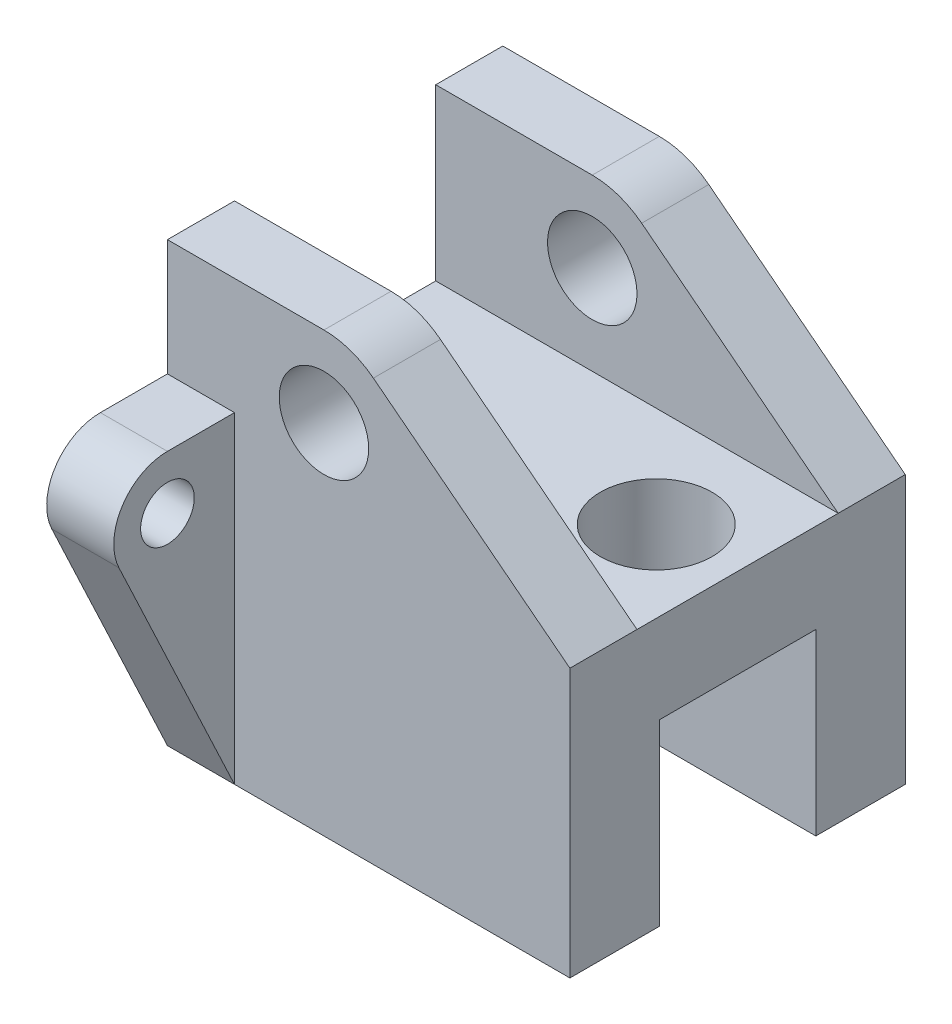
ISO-10303-21;
HEADER;
FILE_DESCRIPTION(('STEP AP214'),'2;1');
FILE_NAME('part.step','',(''),(''),'','','');
FILE_SCHEMA(('AUTOMOTIVE_DESIGN { 1 0 10303 214 1 1 1 1 }'));
ENDSEC;
DATA;
#1=APPLICATION_CONTEXT('core data for automotive mechanical design processes');
#2=APPLICATION_PROTOCOL_DEFINITION('international standard','automotive_design',2000,#1);
#3=PRODUCT_CONTEXT('',#1,'mechanical');
#4=PRODUCT('Part','Part','',(#3));
#5=PRODUCT_RELATED_PRODUCT_CATEGORY('part','',(#4));
#6=PRODUCT_DEFINITION_FORMATION('','',#4);
#7=PRODUCT_DEFINITION_CONTEXT('part definition',#1,'design');
#8=PRODUCT_DEFINITION('design','',#6,#7);
#9=PRODUCT_DEFINITION_SHAPE('','',#8);
#10=(LENGTH_UNIT() NAMED_UNIT(*) SI_UNIT(.MILLI.,.METRE.));
#11=(NAMED_UNIT(*) PLANE_ANGLE_UNIT() SI_UNIT($,.RADIAN.));
#12=(NAMED_UNIT(*) SI_UNIT($,.STERADIAN.) SOLID_ANGLE_UNIT());
#13=UNCERTAINTY_MEASURE_WITH_UNIT(LENGTH_MEASURE(1.E-05),#10,'distance_accuracy_value','');
#14=(GEOMETRIC_REPRESENTATION_CONTEXT(3) GLOBAL_UNCERTAINTY_ASSIGNED_CONTEXT((#13)) GLOBAL_UNIT_ASSIGNED_CONTEXT((#10,
#11,#12)) REPRESENTATION_CONTEXT('',''));
#15=CARTESIAN_POINT('',(0.,0.,0.));
#16=DIRECTION('',(0.,0.,1.));
#17=DIRECTION('',(1.,0.,0.));
#18=AXIS2_PLACEMENT_3D('',#15,#16,#17);
#19=CARTESIAN_POINT('',(-90.,60.,-49.2063492063491));
#20=DIRECTION('',(0.,0.,-1.));
#21=DIRECTION('',(-1.,0.,0.));
#22=AXIS2_PLACEMENT_3D('',#19,#20,#21);
#23=PLANE('',#22);
#24=CARTESIAN_POINT('',(-55.,80.,-49.2063492063491));
#25=DIRECTION('',(0.,0.,-1.));
#26=DIRECTION('',(-1.,0.,0.));
#27=AXIS2_PLACEMENT_3D('',#24,#25,#26);
#28=CIRCLE('',#27,9.99999999999999);
#29=CARTESIAN_POINT('',(-65.,80.,-49.2063492063491));
#30=VERTEX_POINT('',#29);
#31=EDGE_CURVE('E257',#30,#30,#28,.T.);
#32=ORIENTED_EDGE('',*,*,#31,.F.);
#33=EDGE_LOOP('',(#32));
#34=FACE_BOUND('',#33,.T.);
#35=DIRECTION('',(1.,0.,0.));
#36=VECTOR('',#35,1.);
#37=CARTESIAN_POINT('',(-90.,0.,-49.2063492063491));
#38=LINE('',#37,#36);
#39=CARTESIAN_POINT('',(-75.,0.,-49.2063492063491));
#40=VERTEX_POINT('',#39);
#41=CARTESIAN_POINT('',(0.,0.,-49.2063492063491));
#42=VERTEX_POINT('',#41);
#43=EDGE_CURVE('E210',#40,#42,#38,.T.);
#44=ORIENTED_EDGE('',*,*,#43,.F.);
#45=DIRECTION('',(0.,1.,0.));
#46=VECTOR('',#45,1.);
#47=CARTESIAN_POINT('',(-75.,72.,-49.2063492063491));
#48=LINE('',#47,#46);
#49=CARTESIAN_POINT('',(-75.,72.,-49.2063492063491));
#50=VERTEX_POINT('',#49);
#51=EDGE_CURVE('E203',#40,#50,#48,.T.);
#52=ORIENTED_EDGE('',*,*,#51,.T.);
#53=DIRECTION('',(-1.,0.,0.));
#54=VECTOR('',#53,1.);
#55=CARTESIAN_POINT('',(-75.,72.,-49.2063492063491));
#56=LINE('',#55,#54);
#57=CARTESIAN_POINT('',(-90.,72.,-49.2063492063491));
#58=VERTEX_POINT('',#57);
#59=EDGE_CURVE('E189',#50,#58,#56,.T.);
#60=ORIENTED_EDGE('',*,*,#59,.T.);
#61=DIRECTION('',(0.,1.,0.));
#62=VECTOR('',#61,1.);
#63=CARTESIAN_POINT('',(-90.,60.,-49.2063492063491));
#64=LINE('',#63,#62);
#65=CARTESIAN_POINT('',(-90.,98.,-49.2063492063491));
#66=VERTEX_POINT('',#65);
#67=EDGE_CURVE('E353',#58,#66,#64,.T.);
#68=ORIENTED_EDGE('',*,*,#67,.T.);
#69=DIRECTION('',(1.,0.,0.));
#70=VECTOR('',#69,1.);
#71=CARTESIAN_POINT('',(-90.,98.,-49.2063492063491));
#72=LINE('',#71,#70);
#73=CARTESIAN_POINT('',(-55.,98.,-49.2063492063491));
#74=VERTEX_POINT('',#73);
#75=EDGE_CURVE('E285',#66,#74,#72,.T.);
#76=ORIENTED_EDGE('',*,*,#75,.T.);
#77=CARTESIAN_POINT('',(-55.,80.,-49.2063492063491));
#78=DIRECTION('',(0.,0.,-1.));
#79=DIRECTION('',(-1.,0.,0.));
#80=AXIS2_PLACEMENT_3D('',#77,#78,#79);
#81=CIRCLE('',#80,18.);
#82=CARTESIAN_POINT('',(-43.9438877836644,94.2043085949227,-49.2063492063491));
#83=VERTEX_POINT('',#82);
#84=EDGE_CURVE('E270',#74,#83,#81,.T.);
#85=ORIENTED_EDGE('',*,*,#84,.T.);
#86=DIRECTION('',(0.789128255273486,-0.614228456463086,0.));
#87=VECTOR('',#86,1.);
#88=CARTESIAN_POINT('',(-43.9438877836644,94.2043085949227,-49.2063492063491));
#89=LINE('',#88,#87);
#90=CARTESIAN_POINT('',(0.,60.,-49.2063492063491));
#91=VERTEX_POINT('',#90);
#92=EDGE_CURVE('E264',#83,#91,#89,.T.);
#93=ORIENTED_EDGE('',*,*,#92,.T.);
#94=DIRECTION('',(0.,1.,0.));
#95=VECTOR('',#94,1.);
#96=CARTESIAN_POINT('',(0.,60.,-49.2063492063491));
#97=LINE('',#96,#95);
#98=EDGE_CURVE('E375',#42,#91,#97,.T.);
#99=ORIENTED_EDGE('',*,*,#98,.F.);
#100=EDGE_LOOP('',(#44,#52,#60,#68,#76,#85,#93,#99));
#101=FACE_BOUND('',#100,.T.);
#102=ADVANCED_FACE('F39',(#34,#101),#23,.T.);
#103=CARTESIAN_POINT('',(-90.,60.,25.7936507936508));
#104=DIRECTION('',(0.,1.,0.));
#105=DIRECTION('',(0.,0.,1.));
#106=AXIS2_PLACEMENT_3D('',#103,#104,#105);
#107=PLANE('',#106);
#108=CARTESIAN_POINT('',(-18.1950096257873,60.,-11.7063492063492));
#109=DIRECTION('',(0.,1.,0.));
#110=DIRECTION('',(0.,0.,1.));
#111=AXIS2_PLACEMENT_3D('',#108,#109,#110);
#112=CIRCLE('',#111,12.5);
#113=CARTESIAN_POINT('',(-18.1950096257873,60.,0.793650793650839));
#114=VERTEX_POINT('',#113);
#115=EDGE_CURVE('E828',#114,#114,#112,.T.);
#116=ORIENTED_EDGE('',*,*,#115,.F.);
#117=EDGE_LOOP('',(#116));
#118=FACE_BOUND('',#117,.T.);
#119=DIRECTION('',(0.,0.,1.));
#120=VECTOR('',#119,1.);
#121=CARTESIAN_POINT('',(0.,60.,25.7936507936508));
#122=LINE('',#121,#120);
#123=CARTESIAN_POINT('',(0.,60.,-34.2063492063491));
#124=VERTEX_POINT('',#123);
#125=CARTESIAN_POINT('',(0.,60.,10.7936507936508));
#126=VERTEX_POINT('',#125);
#127=EDGE_CURVE('E378',#124,#126,#122,.T.);
#128=ORIENTED_EDGE('',*,*,#127,.F.);
#129=DIRECTION('',(-1.,0.,0.));
#130=VECTOR('',#129,1.);
#131=CARTESIAN_POINT('',(0.,60.,-34.2063492063491));
#132=LINE('',#131,#130);
#133=CARTESIAN_POINT('',(-90.,60.,-34.2063492063491));
#134=VERTEX_POINT('',#133);
#135=EDGE_CURVE('E269',#124,#134,#132,.T.);
#136=ORIENTED_EDGE('',*,*,#135,.T.);
#137=DIRECTION('',(0.,0.,1.));
#138=VECTOR('',#137,1.);
#139=CARTESIAN_POINT('',(-90.,60.,25.7936507936508));
#140=LINE('',#139,#138);
#141=CARTESIAN_POINT('',(-90.,60.,10.7936507936508));
#142=VERTEX_POINT('',#141);
#143=EDGE_CURVE('E355',#134,#142,#140,.T.);
#144=ORIENTED_EDGE('',*,*,#143,.T.);
#145=DIRECTION('',(1.,0.,0.));
#146=VECTOR('',#145,1.);
#147=CARTESIAN_POINT('',(-90.,60.,10.7936507936508));
#148=LINE('',#147,#146);
#149=EDGE_CURVE('E303',#142,#126,#148,.T.);
#150=ORIENTED_EDGE('',*,*,#149,.T.);
#151=EDGE_LOOP('',(#128,#136,#144,#150));
#152=FACE_BOUND('',#151,.T.);
#153=ADVANCED_FACE('F437',(#118,#152),#107,.T.);
#154=CARTESIAN_POINT('',(-90.,0.,5.79365079365081));
#155=DIRECTION('',(0.,-1.,0.));
#156=DIRECTION('',(0.,0.,-1.));
#157=AXIS2_PLACEMENT_3D('',#154,#155,#156);
#158=PLANE('',#157);
#159=DIRECTION('',(0.,0.,-1.));
#160=VECTOR('',#159,1.);
#161=CARTESIAN_POINT('',(0.,0.,5.79365079365081));
#162=LINE('',#161,#160);
#163=CARTESIAN_POINT('',(0.,0.,25.7936507936508));
#164=VERTEX_POINT('',#163);
#165=CARTESIAN_POINT('',(0.,0.,5.79365079365081));
#166=VERTEX_POINT('',#165);
#167=EDGE_CURVE('E330',#164,#166,#162,.T.);
#168=ORIENTED_EDGE('',*,*,#167,.F.);
#169=DIRECTION('',(1.,0.,0.));
#170=VECTOR('',#169,1.);
#171=CARTESIAN_POINT('',(-90.,0.,25.7936507936508));
#172=LINE('',#171,#170);
#173=CARTESIAN_POINT('',(-75.,0.,25.7936507936508));
#174=VERTEX_POINT('',#173);
#175=EDGE_CURVE('E48',#174,#164,#172,.T.);
#176=ORIENTED_EDGE('',*,*,#175,.F.);
#177=CARTESIAN_POINT('',(-90.,0.,25.7936507936508));
#178=VERTEX_POINT('',#177);
#179=EDGE_CURVE('E11',#178,#174,#172,.T.);
#180=ORIENTED_EDGE('',*,*,#179,.F.);
#181=DIRECTION('',(0.,0.,-1.));
#182=VECTOR('',#181,1.);
#183=CARTESIAN_POINT('',(-90.,0.,5.79365079365081));
#184=LINE('',#183,#182);
#185=CARTESIAN_POINT('',(-90.,0.,5.79365079365081));
#186=VERTEX_POINT('',#185);
#187=EDGE_CURVE('E337',#178,#186,#184,.T.);
#188=ORIENTED_EDGE('',*,*,#187,.T.);
#189=DIRECTION('',(1.,0.,0.));
#190=VECTOR('',#189,1.);
#191=CARTESIAN_POINT('',(-90.,0.,5.79365079365081));
#192=LINE('',#191,#190);
#193=EDGE_CURVE('E360',#186,#166,#192,.T.);
#194=ORIENTED_EDGE('',*,*,#193,.T.);
#195=EDGE_LOOP('',(#168,#176,#180,#188,#194));
#196=FACE_BOUND('',#195,.T.);
#197=ADVANCED_FACE('F41',(#196),#158,.T.);
#198=CARTESIAN_POINT('',(-90.,0.,25.7936507936508));
#199=DIRECTION('',(0.,0.,1.));
#200=DIRECTION('',(0.,-1.,0.));
#201=AXIS2_PLACEMENT_3D('',#198,#199,#200);
#202=PLANE('',#201);
#203=DIRECTION('',(-1.,0.,0.));
#204=VECTOR('',#203,1.);
#205=CARTESIAN_POINT('',(-75.,72.,25.7936507936508));
#206=LINE('',#205,#204);
#207=CARTESIAN_POINT('',(-75.,72.,25.7936507936508));
#208=VERTEX_POINT('',#207);
#209=CARTESIAN_POINT('',(-90.,72.,25.7936507936508));
#210=VERTEX_POINT('',#209);
#211=EDGE_CURVE('E255',#208,#210,#206,.T.);
#212=ORIENTED_EDGE('',*,*,#211,.F.);
#213=DIRECTION('',(0.,-1.,0.));
#214=VECTOR('',#213,1.);
#215=CARTESIAN_POINT('',(-75.,0.,25.7936507936508));
#216=LINE('',#215,#214);
#217=EDGE_CURVE('E244',#208,#174,#216,.T.);
#218=ORIENTED_EDGE('',*,*,#217,.T.);
#219=ORIENTED_EDGE('',*,*,#175,.T.);
#220=DIRECTION('',(0.,-1.,0.));
#221=VECTOR('',#220,1.);
#222=CARTESIAN_POINT('',(0.,0.,25.7936507936508));
#223=LINE('',#222,#221);
#224=CARTESIAN_POINT('',(0.,60.,25.7936507936508));
#225=VERTEX_POINT('',#224);
#226=EDGE_CURVE('E341',#225,#164,#223,.T.);
#227=ORIENTED_EDGE('',*,*,#226,.F.);
#228=DIRECTION('',(-0.789128255273486,0.614228456463086,0.));
#229=VECTOR('',#228,1.);
#230=CARTESIAN_POINT('',(0.,60.,25.7936507936508));
#231=LINE('',#230,#229);
#232=CARTESIAN_POINT('',(-43.9438877836645,94.2043085949227,25.7936507936508));
#233=VERTEX_POINT('',#232);
#234=EDGE_CURVE('E300',#225,#233,#231,.T.);
#235=ORIENTED_EDGE('',*,*,#234,.T.);
#236=CARTESIAN_POINT('',(-55.,80.,25.7936507936508));
#237=DIRECTION('',(0.,0.,1.));
#238=DIRECTION('',(1.,0.,0.));
#239=AXIS2_PLACEMENT_3D('',#236,#237,#238);
#240=CIRCLE('',#239,18.);
#241=CARTESIAN_POINT('',(-55.,98.,25.7936507936508));
#242=VERTEX_POINT('',#241);
#243=EDGE_CURVE('E322',#233,#242,#240,.T.);
#244=ORIENTED_EDGE('',*,*,#243,.T.);
#245=DIRECTION('',(-1.,0.,0.));
#246=VECTOR('',#245,1.);
#247=CARTESIAN_POINT('',(-55.,98.,25.7936507936508));
#248=LINE('',#247,#246);
#249=CARTESIAN_POINT('',(-90.,98.,25.7936507936508));
#250=VERTEX_POINT('',#249);
#251=EDGE_CURVE('E307',#242,#250,#248,.T.);
#252=ORIENTED_EDGE('',*,*,#251,.T.);
#253=DIRECTION('',(0.,-1.,0.));
#254=VECTOR('',#253,1.);
#255=CARTESIAN_POINT('',(-90.,0.,25.7936507936508));
#256=LINE('',#255,#254);
#257=EDGE_CURVE('E357',#250,#210,#256,.T.);
#258=ORIENTED_EDGE('',*,*,#257,.T.);
#259=EDGE_LOOP('',(#212,#218,#219,#227,#235,#244,#252,#258));
#260=FACE_BOUND('',#259,.T.);
#261=CARTESIAN_POINT('',(-55.,80.,25.7936507936508));
#262=DIRECTION('',(0.,0.,1.));
#263=DIRECTION('',(1.,0.,0.));
#264=AXIS2_PLACEMENT_3D('',#261,#262,#263);
#265=CIRCLE('',#264,10.);
#266=CARTESIAN_POINT('',(-45.,80.,25.7936507936508));
#267=VERTEX_POINT('',#266);
#268=EDGE_CURVE('E292',#267,#267,#265,.T.);
#269=ORIENTED_EDGE('',*,*,#268,.F.);
#270=EDGE_LOOP('',(#269));
#271=FACE_BOUND('',#270,.T.);
#272=ADVANCED_FACE('F407',(#260,#271),#202,.T.);
#273=CARTESIAN_POINT('',(-90.,0.,-49.2063492063491));
#274=DIRECTION('',(0.,-1.,0.));
#275=DIRECTION('',(0.,0.,-1.));
#276=AXIS2_PLACEMENT_3D('',#273,#274,#275);
#277=PLANE('',#276);
#278=DIRECTION('',(0.,0.,-1.));
#279=VECTOR('',#278,1.);
#280=CARTESIAN_POINT('',(0.,0.,-49.2063492063491));
#281=LINE('',#280,#279);
#282=CARTESIAN_POINT('',(0.,0.,-29.2063492063492));
#283=VERTEX_POINT('',#282);
#284=EDGE_CURVE('E372',#283,#42,#281,.T.);
#285=ORIENTED_EDGE('',*,*,#284,.F.);
#286=DIRECTION('',(1.,0.,0.));
#287=VECTOR('',#286,1.);
#288=CARTESIAN_POINT('',(-90.,0.,-29.2063492063492));
#289=LINE('',#288,#287);
#290=CARTESIAN_POINT('',(-90.,0.,-29.2063492063492));
#291=VERTEX_POINT('',#290);
#292=EDGE_CURVE('E386',#291,#283,#289,.T.);
#293=ORIENTED_EDGE('',*,*,#292,.F.);
#294=DIRECTION('',(0.,0.,-1.));
#295=VECTOR('',#294,1.);
#296=CARTESIAN_POINT('',(-90.,0.,-49.2063492063491));
#297=LINE('',#296,#295);
#298=CARTESIAN_POINT('',(-90.,0.,-49.2063492063491));
#299=VERTEX_POINT('',#298);
#300=EDGE_CURVE('E350',#291,#299,#297,.T.);
#301=ORIENTED_EDGE('',*,*,#300,.T.);
#302=EDGE_CURVE('E384',#299,#40,#38,.T.);
#303=ORIENTED_EDGE('',*,*,#302,.T.);
#304=ORIENTED_EDGE('',*,*,#43,.T.);
#305=EDGE_LOOP('',(#285,#293,#301,#303,#304));
#306=FACE_BOUND('',#305,.T.);
#307=ADVANCED_FACE('F423',(#306),#277,.T.);
#308=CARTESIAN_POINT('',(-90.,0.,-29.2063492063492));
#309=DIRECTION('',(0.,0.,1.));
#310=DIRECTION('',(1.,0.,0.));
#311=AXIS2_PLACEMENT_3D('',#308,#309,#310);
#312=PLANE('',#311);
#313=DIRECTION('',(0.,-1.,0.));
#314=VECTOR('',#313,1.);
#315=CARTESIAN_POINT('',(0.,0.,-29.2063492063492));
#316=LINE('',#315,#314);
#317=CARTESIAN_POINT('',(0.,40.,-29.2063492063492));
#318=VERTEX_POINT('',#317);
#319=EDGE_CURVE('E369',#318,#283,#316,.T.);
#320=ORIENTED_EDGE('',*,*,#319,.F.);
#321=DIRECTION('',(1.,0.,0.));
#322=VECTOR('',#321,1.);
#323=CARTESIAN_POINT('',(-90.,40.,-29.2063492063492));
#324=LINE('',#323,#322);
#325=CARTESIAN_POINT('',(-90.,40.,-29.2063492063492));
#326=VERTEX_POINT('',#325);
#327=EDGE_CURVE('E388',#326,#318,#324,.T.);
#328=ORIENTED_EDGE('',*,*,#327,.F.);
#329=DIRECTION('',(0.,-1.,0.));
#330=VECTOR('',#329,1.);
#331=CARTESIAN_POINT('',(-90.,0.,-29.2063492063492));
#332=LINE('',#331,#330);
#333=EDGE_CURVE('E347',#326,#291,#332,.T.);
#334=ORIENTED_EDGE('',*,*,#333,.T.);
#335=ORIENTED_EDGE('',*,*,#292,.T.);
#336=EDGE_LOOP('',(#320,#328,#334,#335));
#337=FACE_BOUND('',#336,.T.);
#338=ADVANCED_FACE('F421',(#337),#312,.T.);
#339=CARTESIAN_POINT('',(-90.,40.,-29.2063492063492));
#340=DIRECTION('',(0.,-1.,0.));
#341=DIRECTION('',(0.,0.,-1.));
#342=AXIS2_PLACEMENT_3D('',#339,#340,#341);
#343=PLANE('',#342);
#344=CARTESIAN_POINT('',(-18.1950096257873,40.,-11.7063492063492));
#345=DIRECTION('',(0.,-1.,0.));
#346=DIRECTION('',(0.,0.,-1.));
#347=AXIS2_PLACEMENT_3D('',#344,#345,#346);
#348=CIRCLE('',#347,12.5);
#349=CARTESIAN_POINT('',(-18.1950096257873,40.,-24.2063492063492));
#350=VERTEX_POINT('',#349);
#351=EDGE_CURVE('E43',#350,#350,#348,.T.);
#352=ORIENTED_EDGE('',*,*,#351,.F.);
#353=EDGE_LOOP('',(#352));
#354=FACE_BOUND('',#353,.T.);
#355=DIRECTION('',(0.,0.,-1.));
#356=VECTOR('',#355,1.);
#357=CARTESIAN_POINT('',(0.,40.,-29.2063492063492));
#358=LINE('',#357,#356);
#359=CARTESIAN_POINT('',(0.,40.,5.79365079365082));
#360=VERTEX_POINT('',#359);
#361=EDGE_CURVE('E366',#360,#318,#358,.T.);
#362=ORIENTED_EDGE('',*,*,#361,.F.);
#363=DIRECTION('',(1.,0.,0.));
#364=VECTOR('',#363,1.);
#365=CARTESIAN_POINT('',(-90.,40.,5.79365079365082));
#366=LINE('',#365,#364);
#367=CARTESIAN_POINT('',(-90.,40.,5.79365079365082));
#368=VERTEX_POINT('',#367);
#369=EDGE_CURVE('E390',#368,#360,#366,.T.);
#370=ORIENTED_EDGE('',*,*,#369,.F.);
#371=DIRECTION('',(0.,0.,-1.));
#372=VECTOR('',#371,1.);
#373=CARTESIAN_POINT('',(-90.,40.,-29.2063492063492));
#374=LINE('',#373,#372);
#375=EDGE_CURVE('E344',#368,#326,#374,.T.);
#376=ORIENTED_EDGE('',*,*,#375,.T.);
#377=ORIENTED_EDGE('',*,*,#327,.T.);
#378=EDGE_LOOP('',(#362,#370,#376,#377));
#379=FACE_BOUND('',#378,.T.);
#380=ADVANCED_FACE('F417',(#354,#379),#343,.T.);
#381=CARTESIAN_POINT('',(-90.,40.,5.79365079365082));
#382=DIRECTION('',(0.,0.,-1.));
#383=DIRECTION('',(0.,1.,0.));
#384=AXIS2_PLACEMENT_3D('',#381,#382,#383);
#385=PLANE('',#384);
#386=DIRECTION('',(0.,1.,0.));
#387=VECTOR('',#386,1.);
#388=CARTESIAN_POINT('',(0.,40.,5.79365079365082));
#389=LINE('',#388,#387);
#390=EDGE_CURVE('E363',#166,#360,#389,.T.);
#391=ORIENTED_EDGE('',*,*,#390,.F.);
#392=ORIENTED_EDGE('',*,*,#193,.F.);
#393=DIRECTION('',(0.,1.,0.));
#394=VECTOR('',#393,1.);
#395=CARTESIAN_POINT('',(-90.,40.,5.79365079365082));
#396=LINE('',#395,#394);
#397=EDGE_CURVE('E340',#186,#368,#396,.T.);
#398=ORIENTED_EDGE('',*,*,#397,.T.);
#399=ORIENTED_EDGE('',*,*,#369,.T.);
#400=EDGE_LOOP('',(#391,#392,#398,#399));
#401=FACE_BOUND('',#400,.T.);
#402=ADVANCED_FACE('F399',(#401),#385,.T.);
#403=CARTESIAN_POINT('',(-90.,0.,0.));
#404=DIRECTION('',(-1.,0.,0.));
#405=DIRECTION('',(0.,0.,1.));
#406=AXIS2_PLACEMENT_3D('',#403,#404,#405);
#407=PLANE('',#406);
#408=ORIENTED_EDGE('',*,*,#187,.F.);
#409=DIRECTION('',(0.,0.904646984289726,0.426161746072432));
#410=VECTOR('',#409,1.);
#411=CARTESIAN_POINT('',(-90.,0.,25.7936507936508));
#412=LINE('',#411,#410);
#413=CARTESIAN_POINT('',(-90.,54.8860590471308,51.6494146051275));
#414=VERTEX_POINT('',#413);
#415=EDGE_CURVE('E234',#178,#414,#412,.T.);
#416=ORIENTED_EDGE('',*,*,#415,.T.);
#417=CARTESIAN_POINT('',(-90.,60.,40.7936507936508));
#418=DIRECTION('',(-1.,0.,0.));
#419=DIRECTION('',(0.,0.,-1.));
#420=AXIS2_PLACEMENT_3D('',#417,#418,#419);
#421=CIRCLE('',#420,12.);
#422=CARTESIAN_POINT('',(-90.,72.,40.7936507936508));
#423=VERTEX_POINT('',#422);
#424=EDGE_CURVE('E250',#414,#423,#421,.T.);
#425=ORIENTED_EDGE('',*,*,#424,.T.);
#426=DIRECTION('',(0.,0.,-1.));
#427=VECTOR('',#426,1.);
#428=CARTESIAN_POINT('',(-90.,72.,25.7936507936508));
#429=LINE('',#428,#427);
#430=EDGE_CURVE('E239',#423,#210,#429,.T.);
#431=ORIENTED_EDGE('',*,*,#430,.T.);
#432=ORIENTED_EDGE('',*,*,#257,.F.);
#433=DIRECTION('',(0.,0.,1.));
#434=VECTOR('',#433,1.);
#435=CARTESIAN_POINT('',(-90.,98.,10.7936507936508));
#436=LINE('',#435,#434);
#437=CARTESIAN_POINT('',(-90.,98.,10.7936507936508));
#438=VERTEX_POINT('',#437);
#439=EDGE_CURVE('E327',#438,#250,#436,.T.);
#440=ORIENTED_EDGE('',*,*,#439,.F.);
#441=DIRECTION('',(0.,-1.,0.));
#442=VECTOR('',#441,1.);
#443=CARTESIAN_POINT('',(-90.,98.,10.7936507936508));
#444=LINE('',#443,#442);
#445=EDGE_CURVE('E316',#438,#142,#444,.T.);
#446=ORIENTED_EDGE('',*,*,#445,.T.);
#447=ORIENTED_EDGE('',*,*,#143,.F.);
#448=DIRECTION('',(0.,1.,0.));
#449=VECTOR('',#448,1.);
#450=CARTESIAN_POINT('',(-90.,60.,-34.2063492063491));
#451=LINE('',#450,#449);
#452=CARTESIAN_POINT('',(-90.,98.,-34.2063492063491));
#453=VERTEX_POINT('',#452);
#454=EDGE_CURVE('E273',#134,#453,#451,.T.);
#455=ORIENTED_EDGE('',*,*,#454,.T.);
#456=DIRECTION('',(0.,0.,-1.));
#457=VECTOR('',#456,1.);
#458=CARTESIAN_POINT('',(-90.,98.,-34.2063492063491));
#459=LINE('',#458,#457);
#460=EDGE_CURVE('E282',#453,#66,#459,.T.);
#461=ORIENTED_EDGE('',*,*,#460,.T.);
#462=ORIENTED_EDGE('',*,*,#67,.F.);
#463=DIRECTION('',(0.,0.,-1.));
#464=VECTOR('',#463,1.);
#465=CARTESIAN_POINT('',(-90.,72.,-64.2063492063491));
#466=LINE('',#465,#464);
#467=CARTESIAN_POINT('',(-90.,72.,-64.2063492063491));
#468=VERTEX_POINT('',#467);
#469=EDGE_CURVE('E56',#58,#468,#466,.T.);
#470=ORIENTED_EDGE('',*,*,#469,.T.);
#471=CARTESIAN_POINT('',(-90.,60.,-64.2063492063491));
#472=DIRECTION('',(-1.,0.,0.));
#473=DIRECTION('',(0.,0.,1.));
#474=AXIS2_PLACEMENT_3D('',#471,#472,#473);
#475=CIRCLE('',#474,12.);
#476=CARTESIAN_POINT('',(-90.,54.8860590471308,-75.0621130178258));
#477=VERTEX_POINT('',#476);
#478=EDGE_CURVE('E215',#468,#477,#475,.T.);
#479=ORIENTED_EDGE('',*,*,#478,.T.);
#480=DIRECTION('',(0.,-0.904646984289726,0.426161746072431));
#481=VECTOR('',#480,1.);
#482=CARTESIAN_POINT('',(-90.,0.,-49.2063492063491));
#483=LINE('',#482,#481);
#484=EDGE_CURVE('E212',#477,#299,#483,.T.);
#485=ORIENTED_EDGE('',*,*,#484,.T.);
#486=ORIENTED_EDGE('',*,*,#300,.F.);
#487=ORIENTED_EDGE('',*,*,#333,.F.);
#488=ORIENTED_EDGE('',*,*,#375,.F.);
#489=ORIENTED_EDGE('',*,*,#397,.F.);
#490=EDGE_LOOP('',(#408,#416,#425,#431,#432,#440,#446,#447,#455,#461,#462,#470,#479,#485,#486,
#487,#488,#489));
#491=FACE_BOUND('',#490,.T.);
#492=CARTESIAN_POINT('',(-90.,60.,40.7936507936508));
#493=DIRECTION('',(-1.,0.,0.));
#494=DIRECTION('',(0.,0.,1.));
#495=AXIS2_PLACEMENT_3D('',#492,#493,#494);
#496=CIRCLE('',#495,5.99999999999999);
#497=CARTESIAN_POINT('',(-90.,60.,46.7936507936508));
#498=VERTEX_POINT('',#497);
#499=EDGE_CURVE('E229',#498,#498,#496,.T.);
#500=ORIENTED_EDGE('',*,*,#499,.F.);
#501=EDGE_LOOP('',(#500));
#502=FACE_BOUND('',#501,.T.);
#503=CARTESIAN_POINT('',(-90.,60.,-64.2063492063491));
#504=DIRECTION('',(-1.,0.,0.));
#505=DIRECTION('',(0.,0.,1.));
#506=AXIS2_PLACEMENT_3D('',#503,#504,#505);
#507=CIRCLE('',#506,6.);
#508=CARTESIAN_POINT('',(-90.,60.,-58.2063492063491));
#509=VERTEX_POINT('',#508);
#510=EDGE_CURVE('E218',#509,#509,#507,.T.);
#511=ORIENTED_EDGE('',*,*,#510,.F.);
#512=EDGE_LOOP('',(#511));
#513=FACE_BOUND('',#512,.T.);
#514=ADVANCED_FACE('F411',(#491,#502,#513),#407,.T.);
#515=CARTESIAN_POINT('',(0.,0.,0.));
#516=DIRECTION('',(-1.,0.,0.));
#517=DIRECTION('',(0.,0.,1.));
#518=AXIS2_PLACEMENT_3D('',#515,#516,#517);
#519=PLANE('',#518);
#520=ORIENTED_EDGE('',*,*,#167,.T.);
#521=ORIENTED_EDGE('',*,*,#390,.T.);
#522=ORIENTED_EDGE('',*,*,#361,.T.);
#523=ORIENTED_EDGE('',*,*,#319,.T.);
#524=ORIENTED_EDGE('',*,*,#284,.T.);
#525=ORIENTED_EDGE('',*,*,#98,.T.);
#526=EDGE_CURVE('E379',#91,#124,#122,.T.);
#527=ORIENTED_EDGE('',*,*,#526,.T.);
#528=ORIENTED_EDGE('',*,*,#127,.T.);
#529=DIRECTION('',(0.,0.,1.));
#530=VECTOR('',#529,1.);
#531=CARTESIAN_POINT('',(0.,60.,10.7936507936508));
#532=LINE('',#531,#530);
#533=EDGE_CURVE('E319',#126,#225,#532,.T.);
#534=ORIENTED_EDGE('',*,*,#533,.T.);
#535=ORIENTED_EDGE('',*,*,#226,.T.);
#536=EDGE_LOOP('',(#520,#521,#522,#523,#524,#525,#527,#528,#534,#535));
#537=FACE_BOUND('',#536,.T.);
#538=ADVANCED_FACE('F402',(#537),#519,.F.);
#539=CARTESIAN_POINT('',(-55.,98.,10.7936507936508));
#540=DIRECTION('',(0.,1.,0.));
#541=DIRECTION('',(0.,0.,1.));
#542=AXIS2_PLACEMENT_3D('',#539,#540,#541);
#543=PLANE('',#542);
#544=ORIENTED_EDGE('',*,*,#251,.F.);
#545=DIRECTION('',(0.,0.,1.));
#546=VECTOR('',#545,1.);
#547=CARTESIAN_POINT('',(-55.,98.,10.7936507936508));
#548=LINE('',#547,#546);
#549=CARTESIAN_POINT('',(-55.,98.,10.7936507936508));
#550=VERTEX_POINT('',#549);
#551=EDGE_CURVE('E331',#550,#242,#548,.T.);
#552=ORIENTED_EDGE('',*,*,#551,.F.);
#553=DIRECTION('',(-1.,0.,0.));
#554=VECTOR('',#553,1.);
#555=CARTESIAN_POINT('',(-55.,98.,10.7936507936508));
#556=LINE('',#555,#554);
#557=EDGE_CURVE('E313',#550,#438,#556,.T.);
#558=ORIENTED_EDGE('',*,*,#557,.T.);
#559=ORIENTED_EDGE('',*,*,#439,.T.);
#560=EDGE_LOOP('',(#544,#552,#558,#559));
#561=FACE_BOUND('',#560,.T.);
#562=ADVANCED_FACE('F446',(#561),#543,.T.);
#563=CARTESIAN_POINT('',(-55.,80.,10.7936507936508));
#564=DIRECTION('',(0.,0.,1.));
#565=DIRECTION('',(1.,0.,0.));
#566=AXIS2_PLACEMENT_3D('',#563,#564,#565);
#567=CYLINDRICAL_SURFACE('',#566,18.);
#568=ORIENTED_EDGE('',*,*,#243,.F.);
#569=DIRECTION('',(0.,0.,1.));
#570=VECTOR('',#569,1.);
#571=CARTESIAN_POINT('',(-43.9438877836645,94.2043085949227,10.7936507936508));
#572=LINE('',#571,#570);
#573=CARTESIAN_POINT('',(-43.9438877836645,94.2043085949227,10.7936507936508));
#574=VERTEX_POINT('',#573);
#575=EDGE_CURVE('E333',#574,#233,#572,.T.);
#576=ORIENTED_EDGE('',*,*,#575,.F.);
#577=CARTESIAN_POINT('',(-55.,80.,10.7936507936508));
#578=DIRECTION('',(0.,0.,1.));
#579=DIRECTION('',(1.,0.,0.));
#580=AXIS2_PLACEMENT_3D('',#577,#578,#579);
#581=CIRCLE('',#580,18.);
#582=EDGE_CURVE('E310',#574,#550,#581,.T.);
#583=ORIENTED_EDGE('',*,*,#582,.T.);
#584=ORIENTED_EDGE('',*,*,#551,.T.);
#585=EDGE_LOOP('',(#568,#576,#583,#584));
#586=FACE_BOUND('',#585,.T.);
#587=ADVANCED_FACE('F449',(#586),#567,.T.);
#588=CARTESIAN_POINT('',(0.,60.,10.7936507936508));
#589=DIRECTION('',(0.614228456463086,0.789128255273486,0.));
#590=DIRECTION('',(-0.789128255273486,0.614228456463086,0.));
#591=AXIS2_PLACEMENT_3D('',#588,#589,#590);
#592=PLANE('',#591);
#593=ORIENTED_EDGE('',*,*,#234,.F.);
#594=ORIENTED_EDGE('',*,*,#533,.F.);
#595=DIRECTION('',(-0.789128255273486,0.614228456463086,0.));
#596=VECTOR('',#595,1.);
#597=CARTESIAN_POINT('',(0.,60.,10.7936507936508));
#598=LINE('',#597,#596);
#599=EDGE_CURVE('E306',#126,#574,#598,.T.);
#600=ORIENTED_EDGE('',*,*,#599,.T.);
#601=ORIENTED_EDGE('',*,*,#575,.T.);
#602=EDGE_LOOP('',(#593,#594,#600,#601));
#603=FACE_BOUND('',#602,.T.);
#604=ADVANCED_FACE('F451',(#603),#592,.T.);
#605=CARTESIAN_POINT('',(-55.,80.,10.7936507936508));
#606=DIRECTION('',(0.,0.,1.));
#607=DIRECTION('',(1.,0.,0.));
#608=AXIS2_PLACEMENT_3D('',#605,#606,#607);
#609=PLANE('',#608);
#610=CARTESIAN_POINT('',(-55.,80.,10.7936507936508));
#611=DIRECTION('',(0.,0.,1.));
#612=DIRECTION('',(1.,0.,0.));
#613=AXIS2_PLACEMENT_3D('',#610,#611,#612);
#614=CIRCLE('',#613,10.);
#615=CARTESIAN_POINT('',(-45.,80.,10.7936507936508));
#616=VERTEX_POINT('',#615);
#617=EDGE_CURVE('E297',#616,#616,#614,.T.);
#618=ORIENTED_EDGE('',*,*,#617,.T.);
#619=EDGE_LOOP('',(#618));
#620=FACE_BOUND('',#619,.T.);
#621=ORIENTED_EDGE('',*,*,#149,.F.);
#622=ORIENTED_EDGE('',*,*,#445,.F.);
#623=ORIENTED_EDGE('',*,*,#557,.F.);
#624=ORIENTED_EDGE('',*,*,#582,.F.);
#625=ORIENTED_EDGE('',*,*,#599,.F.);
#626=EDGE_LOOP('',(#621,#622,#623,#624,#625));
#627=FACE_BOUND('',#626,.T.);
#628=ADVANCED_FACE('F441',(#620,#627),#609,.F.);
#629=CARTESIAN_POINT('',(-55.,80.,10.7936507936508));
#630=DIRECTION('',(0.,0.,1.));
#631=DIRECTION('',(1.,0.,0.));
#632=AXIS2_PLACEMENT_3D('',#629,#630,#631);
#633=CYLINDRICAL_SURFACE('',#632,10.);
#634=ORIENTED_EDGE('',*,*,#617,.F.);
#635=EDGE_LOOP('',(#634));
#636=FACE_BOUND('',#635,.T.);
#637=ORIENTED_EDGE('',*,*,#268,.T.);
#638=EDGE_LOOP('',(#637));
#639=FACE_BOUND('',#638,.T.);
#640=ADVANCED_FACE('F458',(#636,#639),#633,.F.);
#641=CARTESIAN_POINT('',(-43.9438877836644,94.2043085949227,-34.2063492063491));
#642=DIRECTION('',(0.614228456463086,0.789128255273485,0.));
#643=DIRECTION('',(-0.789128255273486,0.614228456463086,0.));
#644=AXIS2_PLACEMENT_3D('',#641,#642,#643);
#645=PLANE('',#644);
#646=ORIENTED_EDGE('',*,*,#92,.F.);
#647=DIRECTION('',(0.,0.,-1.));
#648=VECTOR('',#647,1.);
#649=CARTESIAN_POINT('',(-43.9438877836644,94.2043085949227,-34.2063492063491));
#650=LINE('',#649,#648);
#651=CARTESIAN_POINT('',(-43.9438877836644,94.2043085949227,-34.2063492063491));
#652=VERTEX_POINT('',#651);
#653=EDGE_CURVE('E290',#652,#83,#650,.T.);
#654=ORIENTED_EDGE('',*,*,#653,.F.);
#655=DIRECTION('',(0.789128255273486,-0.614228456463086,0.));
#656=VECTOR('',#655,1.);
#657=CARTESIAN_POINT('',(-43.9438877836644,94.2043085949227,-34.2063492063491));
#658=LINE('',#657,#656);
#659=EDGE_CURVE('E267',#652,#124,#658,.T.);
#660=ORIENTED_EDGE('',*,*,#659,.T.);
#661=ORIENTED_EDGE('',*,*,#526,.F.);
#662=EDGE_LOOP('',(#646,#654,#660,#661));
#663=FACE_BOUND('',#662,.T.);
#664=ADVANCED_FACE('F428',(#663),#645,.T.);
#665=CARTESIAN_POINT('',(-55.,80.,-34.2063492063491));
#666=DIRECTION('',(0.,0.,-1.));
#667=DIRECTION('',(-1.,0.,0.));
#668=AXIS2_PLACEMENT_3D('',#665,#666,#667);
#669=CYLINDRICAL_SURFACE('',#668,18.);
#670=ORIENTED_EDGE('',*,*,#84,.F.);
#671=DIRECTION('',(0.,0.,-1.));
#672=VECTOR('',#671,1.);
#673=CARTESIAN_POINT('',(-55.,98.,-34.2063492063491));
#674=LINE('',#673,#672);
#675=CARTESIAN_POINT('',(-55.,98.,-34.2063492063491));
#676=VERTEX_POINT('',#675);
#677=EDGE_CURVE('E293',#676,#74,#674,.T.);
#678=ORIENTED_EDGE('',*,*,#677,.F.);
#679=CARTESIAN_POINT('',(-55.,80.,-34.2063492063491));
#680=DIRECTION('',(0.,0.,-1.));
#681=DIRECTION('',(-1.,0.,0.));
#682=AXIS2_PLACEMENT_3D('',#679,#680,#681);
#683=CIRCLE('',#682,18.);
#684=EDGE_CURVE('E279',#676,#652,#683,.T.);
#685=ORIENTED_EDGE('',*,*,#684,.T.);
#686=ORIENTED_EDGE('',*,*,#653,.T.);
#687=EDGE_LOOP('',(#670,#678,#685,#686));
#688=FACE_BOUND('',#687,.T.);
#689=ADVANCED_FACE('F631',(#688),#669,.T.);
#690=CARTESIAN_POINT('',(-90.,98.,-34.2063492063491));
#691=DIRECTION('',(0.,1.,0.));
#692=DIRECTION('',(0.,0.,1.));
#693=AXIS2_PLACEMENT_3D('',#690,#691,#692);
#694=PLANE('',#693);
#695=ORIENTED_EDGE('',*,*,#75,.F.);
#696=ORIENTED_EDGE('',*,*,#460,.F.);
#697=DIRECTION('',(1.,0.,0.));
#698=VECTOR('',#697,1.);
#699=CARTESIAN_POINT('',(-90.,98.,-34.2063492063491));
#700=LINE('',#699,#698);
#701=EDGE_CURVE('E276',#453,#676,#700,.T.);
#702=ORIENTED_EDGE('',*,*,#701,.T.);
#703=ORIENTED_EDGE('',*,*,#677,.T.);
#704=EDGE_LOOP('',(#695,#696,#702,#703));
#705=FACE_BOUND('',#704,.T.);
#706=ADVANCED_FACE('F639',(#705),#694,.T.);
#707=CARTESIAN_POINT('',(-55.,80.,-34.2063492063491));
#708=DIRECTION('',(0.,0.,-1.));
#709=DIRECTION('',(-1.,0.,0.));
#710=AXIS2_PLACEMENT_3D('',#707,#708,#709);
#711=PLANE('',#710);
#712=CARTESIAN_POINT('',(-55.,80.,-34.2063492063491));
#713=DIRECTION('',(0.,0.,-1.));
#714=DIRECTION('',(-1.,0.,0.));
#715=AXIS2_PLACEMENT_3D('',#712,#713,#714);
#716=CIRCLE('',#715,9.99999999999999);
#717=CARTESIAN_POINT('',(-65.,80.,-34.2063492063491));
#718=VERTEX_POINT('',#717);
#719=EDGE_CURVE('E261',#718,#718,#716,.T.);
#720=ORIENTED_EDGE('',*,*,#719,.T.);
#721=EDGE_LOOP('',(#720));
#722=FACE_BOUND('',#721,.T.);
#723=ORIENTED_EDGE('',*,*,#659,.F.);
#724=ORIENTED_EDGE('',*,*,#684,.F.);
#725=ORIENTED_EDGE('',*,*,#701,.F.);
#726=ORIENTED_EDGE('',*,*,#454,.F.);
#727=ORIENTED_EDGE('',*,*,#135,.F.);
#728=EDGE_LOOP('',(#723,#724,#725,#726,#727));
#729=FACE_BOUND('',#728,.T.);
#730=ADVANCED_FACE('F433',(#722,#729),#711,.F.);
#731=CARTESIAN_POINT('',(-55.,80.,-34.2063492063491));
#732=DIRECTION('',(0.,0.,-1.));
#733=DIRECTION('',(-1.,0.,0.));
#734=AXIS2_PLACEMENT_3D('',#731,#732,#733);
#735=CYLINDRICAL_SURFACE('',#734,9.99999999999999);
#736=ORIENTED_EDGE('',*,*,#719,.F.);
#737=EDGE_LOOP('',(#736));
#738=FACE_BOUND('',#737,.T.);
#739=ORIENTED_EDGE('',*,*,#31,.T.);
#740=EDGE_LOOP('',(#739));
#741=FACE_BOUND('',#740,.T.);
#742=ADVANCED_FACE('F556',(#738,#741),#735,.F.);
#743=CARTESIAN_POINT('',(-75.,0.,25.7936507936508));
#744=DIRECTION('',(0.,-0.426161746072432,0.904646984289726));
#745=DIRECTION('',(0.,-0.904646984289726,-0.426161746072432));
#746=AXIS2_PLACEMENT_3D('',#743,#744,#745);
#747=PLANE('',#746);
#748=ORIENTED_EDGE('',*,*,#415,.F.);
#749=ORIENTED_EDGE('',*,*,#179,.T.);
#750=DIRECTION('',(0.,0.904646984289726,0.426161746072432));
#751=VECTOR('',#750,1.);
#752=CARTESIAN_POINT('',(-75.,0.,25.7936507936508));
#753=LINE('',#752,#751);
#754=CARTESIAN_POINT('',(-75.,54.8860590471308,51.6494146051275));
#755=VERTEX_POINT('',#754);
#756=EDGE_CURVE('E64',#174,#755,#753,.T.);
#757=ORIENTED_EDGE('',*,*,#756,.T.);
#758=DIRECTION('',(-1.,0.,0.));
#759=VECTOR('',#758,1.);
#760=CARTESIAN_POINT('',(-75.,54.8860590471308,51.6494146051275));
#761=LINE('',#760,#759);
#762=EDGE_CURVE('E247',#755,#414,#761,.T.);
#763=ORIENTED_EDGE('',*,*,#762,.T.);
#764=EDGE_LOOP('',(#748,#749,#757,#763));
#765=FACE_BOUND('',#764,.T.);
#766=ADVANCED_FACE('F560',(#765),#747,.T.);
#767=CARTESIAN_POINT('',(-75.,72.,25.7936507936508));
#768=DIRECTION('',(0.,1.,0.));
#769=DIRECTION('',(0.,0.,1.));
#770=AXIS2_PLACEMENT_3D('',#767,#768,#769);
#771=PLANE('',#770);
#772=ORIENTED_EDGE('',*,*,#430,.F.);
#773=DIRECTION('',(-1.,0.,0.));
#774=VECTOR('',#773,1.);
#775=CARTESIAN_POINT('',(-75.,72.,40.7936507936508));
#776=LINE('',#775,#774);
#777=CARTESIAN_POINT('',(-75.,72.,40.7936507936508));
#778=VERTEX_POINT('',#777);
#779=EDGE_CURVE('E258',#778,#423,#776,.T.);
#780=ORIENTED_EDGE('',*,*,#779,.F.);
#781=DIRECTION('',(0.,0.,-1.));
#782=VECTOR('',#781,1.);
#783=CARTESIAN_POINT('',(-75.,72.,25.7936507936508));
#784=LINE('',#783,#782);
#785=EDGE_CURVE('E242',#778,#208,#784,.T.);
#786=ORIENTED_EDGE('',*,*,#785,.T.);
#787=ORIENTED_EDGE('',*,*,#211,.T.);
#788=EDGE_LOOP('',(#772,#780,#786,#787));
#789=FACE_BOUND('',#788,.T.);
#790=ADVANCED_FACE('F669',(#789),#771,.T.);
#791=CARTESIAN_POINT('',(-75.,60.,40.7936507936508));
#792=DIRECTION('',(-1.,0.,0.));
#793=DIRECTION('',(0.,0.,1.));
#794=AXIS2_PLACEMENT_3D('',#791,#792,#793);
#795=CYLINDRICAL_SURFACE('',#794,12.);
#796=ORIENTED_EDGE('',*,*,#424,.F.);
#797=ORIENTED_EDGE('',*,*,#762,.F.);
#798=CARTESIAN_POINT('',(-75.,60.,40.7936507936508));
#799=DIRECTION('',(-1.,0.,0.));
#800=DIRECTION('',(0.,0.,-1.));
#801=AXIS2_PLACEMENT_3D('',#798,#799,#800);
#802=CIRCLE('',#801,12.);
#803=EDGE_CURVE('E238',#755,#778,#802,.T.);
#804=ORIENTED_EDGE('',*,*,#803,.T.);
#805=ORIENTED_EDGE('',*,*,#779,.T.);
#806=EDGE_LOOP('',(#796,#797,#804,#805));
#807=FACE_BOUND('',#806,.T.);
#808=ADVANCED_FACE('F678',(#807),#795,.T.);
#809=CARTESIAN_POINT('',(-75.,60.,40.7936507936508));
#810=DIRECTION('',(1.,0.,0.));
#811=DIRECTION('',(0.,0.,-1.));
#812=AXIS2_PLACEMENT_3D('',#809,#810,#811);
#813=PLANE('',#812);
#814=CARTESIAN_POINT('',(-75.,60.,40.7936507936508));
#815=DIRECTION('',(-1.,0.,0.));
#816=DIRECTION('',(0.,0.,1.));
#817=AXIS2_PLACEMENT_3D('',#814,#815,#816);
#818=CIRCLE('',#817,5.99999999999999);
#819=CARTESIAN_POINT('',(-75.,60.,46.7936507936508));
#820=VERTEX_POINT('',#819);
#821=EDGE_CURVE('E231',#820,#820,#818,.T.);
#822=ORIENTED_EDGE('',*,*,#821,.T.);
#823=EDGE_LOOP('',(#822));
#824=FACE_BOUND('',#823,.T.);
#825=ORIENTED_EDGE('',*,*,#756,.F.);
#826=ORIENTED_EDGE('',*,*,#217,.F.);
#827=ORIENTED_EDGE('',*,*,#785,.F.);
#828=ORIENTED_EDGE('',*,*,#803,.F.);
#829=EDGE_LOOP('',(#825,#826,#827,#828));
#830=FACE_BOUND('',#829,.T.);
#831=ADVANCED_FACE('F547',(#824,#830),#813,.T.);
#832=CARTESIAN_POINT('',(-75.,60.,40.7936507936508));
#833=DIRECTION('',(-1.,0.,0.));
#834=DIRECTION('',(0.,0.,1.));
#835=AXIS2_PLACEMENT_3D('',#832,#833,#834);
#836=CYLINDRICAL_SURFACE('',#835,5.99999999999999);
#837=ORIENTED_EDGE('',*,*,#821,.F.);
#838=EDGE_LOOP('',(#837));
#839=FACE_BOUND('',#838,.T.);
#840=ORIENTED_EDGE('',*,*,#499,.T.);
#841=EDGE_LOOP('',(#840));
#842=FACE_BOUND('',#841,.T.);
#843=ADVANCED_FACE('F541',(#839,#842),#836,.F.);
#844=CARTESIAN_POINT('',(-75.,0.,-49.2063492063491));
#845=DIRECTION('',(0.,-0.426161746072431,-0.904646984289726));
#846=DIRECTION('',(0.,0.904646984289726,-0.426161746072431));
#847=AXIS2_PLACEMENT_3D('',#844,#845,#846);
#848=PLANE('',#847);
#849=ORIENTED_EDGE('',*,*,#484,.F.);
#850=DIRECTION('',(-1.,0.,0.));
#851=VECTOR('',#850,1.);
#852=CARTESIAN_POINT('',(-75.,54.8860590471308,-75.0621130178258));
#853=LINE('',#852,#851);
#854=CARTESIAN_POINT('',(-75.,54.8860590471308,-75.0621130178258));
#855=VERTEX_POINT('',#854);
#856=EDGE_CURVE('E227',#855,#477,#853,.T.);
#857=ORIENTED_EDGE('',*,*,#856,.F.);
#858=DIRECTION('',(0.,-0.904646984289726,0.426161746072431));
#859=VECTOR('',#858,1.);
#860=CARTESIAN_POINT('',(-75.,0.,-49.2063492063491));
#861=LINE('',#860,#859);
#862=EDGE_CURVE('E197',#855,#40,#861,.T.);
#863=ORIENTED_EDGE('',*,*,#862,.T.);
#864=ORIENTED_EDGE('',*,*,#302,.F.);
#865=EDGE_LOOP('',(#849,#857,#863,#864));
#866=FACE_BOUND('',#865,.T.);
#867=ADVANCED_FACE('F546',(#866),#848,.T.);
#868=CARTESIAN_POINT('',(-75.,60.,-64.2063492063491));
#869=DIRECTION('',(-1.,0.,0.));
#870=DIRECTION('',(0.,0.,1.));
#871=AXIS2_PLACEMENT_3D('',#868,#869,#870);
#872=CYLINDRICAL_SURFACE('',#871,12.);
#873=ORIENTED_EDGE('',*,*,#478,.F.);
#874=DIRECTION('',(-1.,0.,0.));
#875=VECTOR('',#874,1.);
#876=CARTESIAN_POINT('',(-75.,72.,-64.2063492063491));
#877=LINE('',#876,#875);
#878=CARTESIAN_POINT('',(-75.,72.,-64.2063492063491));
#879=VERTEX_POINT('',#878);
#880=EDGE_CURVE('E196',#879,#468,#877,.T.);
#881=ORIENTED_EDGE('',*,*,#880,.F.);
#882=CARTESIAN_POINT('',(-75.,60.,-64.2063492063491));
#883=DIRECTION('',(-1.,0.,0.));
#884=DIRECTION('',(0.,0.,1.));
#885=AXIS2_PLACEMENT_3D('',#882,#883,#884);
#886=CIRCLE('',#885,12.);
#887=EDGE_CURVE('E206',#879,#855,#886,.T.);
#888=ORIENTED_EDGE('',*,*,#887,.T.);
#889=ORIENTED_EDGE('',*,*,#856,.T.);
#890=EDGE_LOOP('',(#873,#881,#888,#889));
#891=FACE_BOUND('',#890,.T.);
#892=ADVANCED_FACE('F716',(#891),#872,.T.);
#893=CARTESIAN_POINT('',(-75.,72.,-64.2063492063491));
#894=DIRECTION('',(0.,1.,0.));
#895=DIRECTION('',(0.,0.,1.));
#896=AXIS2_PLACEMENT_3D('',#893,#894,#895);
#897=PLANE('',#896);
#898=ORIENTED_EDGE('',*,*,#469,.F.);
#899=ORIENTED_EDGE('',*,*,#59,.F.);
#900=DIRECTION('',(0.,0.,-1.));
#901=VECTOR('',#900,1.);
#902=CARTESIAN_POINT('',(-75.,72.,-64.2063492063491));
#903=LINE('',#902,#901);
#904=EDGE_CURVE('E192',#50,#879,#903,.T.);
#905=ORIENTED_EDGE('',*,*,#904,.T.);
#906=ORIENTED_EDGE('',*,*,#880,.T.);
#907=EDGE_LOOP('',(#898,#899,#905,#906));
#908=FACE_BOUND('',#907,.T.);
#909=ADVANCED_FACE('F191',(#908),#897,.T.);
#910=CARTESIAN_POINT('',(-75.,60.,-64.2063492063491));
#911=DIRECTION('',(-1.,0.,0.));
#912=DIRECTION('',(0.,0.,1.));
#913=AXIS2_PLACEMENT_3D('',#910,#911,#912);
#914=PLANE('',#913);
#915=CARTESIAN_POINT('',(-75.,60.,-64.2063492063491));
#916=DIRECTION('',(-1.,0.,0.));
#917=DIRECTION('',(0.,0.,1.));
#918=AXIS2_PLACEMENT_3D('',#915,#916,#917);
#919=CIRCLE('',#918,6.);
#920=CARTESIAN_POINT('',(-75.,60.,-58.2063492063491));
#921=VERTEX_POINT('',#920);
#922=EDGE_CURVE('E224',#921,#921,#919,.T.);
#923=ORIENTED_EDGE('',*,*,#922,.T.);
#924=EDGE_LOOP('',(#923));
#925=FACE_BOUND('',#924,.T.);
#926=ORIENTED_EDGE('',*,*,#51,.F.);
#927=ORIENTED_EDGE('',*,*,#862,.F.);
#928=ORIENTED_EDGE('',*,*,#887,.F.);
#929=ORIENTED_EDGE('',*,*,#904,.F.);
#930=EDGE_LOOP('',(#926,#927,#928,#929));
#931=FACE_BOUND('',#930,.T.);
#932=ADVANCED_FACE('F201',(#925,#931),#914,.F.);
#933=CARTESIAN_POINT('',(-75.,60.,-64.2063492063491));
#934=DIRECTION('',(-1.,0.,0.));
#935=DIRECTION('',(0.,0.,1.));
#936=AXIS2_PLACEMENT_3D('',#933,#934,#935);
#937=CYLINDRICAL_SURFACE('',#936,6.);
#938=ORIENTED_EDGE('',*,*,#922,.F.);
#939=EDGE_LOOP('',(#938));
#940=FACE_BOUND('',#939,.T.);
#941=ORIENTED_EDGE('',*,*,#510,.T.);
#942=EDGE_LOOP('',(#941));
#943=FACE_BOUND('',#942,.T.);
#944=ADVANCED_FACE('F508',(#940,#943),#937,.F.);
#945=CARTESIAN_POINT('',(-18.1950096257873,0.,-11.7063492063492));
#946=DIRECTION('',(0.,1.,0.));
#947=DIRECTION('',(0.,0.,1.));
#948=AXIS2_PLACEMENT_3D('',#945,#946,#947);
#949=CYLINDRICAL_SURFACE('',#948,12.5);
#950=ORIENTED_EDGE('',*,*,#351,.T.);
#951=EDGE_LOOP('',(#950));
#952=FACE_BOUND('',#951,.T.);
#953=ORIENTED_EDGE('',*,*,#115,.T.);
#954=EDGE_LOOP('',(#953));
#955=FACE_BOUND('',#954,.T.);
#956=ADVANCED_FACE('F522',(#952,#955),#949,.F.);
#957=CLOSED_SHELL('',(#102,#153,#197,#272,#307,#338,#380,#402,#514,#538,#562,#587,#604,#628,
#640,#664,#689,#706,#730,#742,#766,#790,#808,#831,#843,#867,#892,#909,#932,#944,#956));
#958=MANIFOLD_SOLID_BREP('B2',#957);
#959=ADVANCED_BREP_SHAPE_REPRESENTATION('',(#18,#958),#14);
#960=SHAPE_DEFINITION_REPRESENTATION(#9,#959);
ENDSEC;
END-ISO-10303-21;
